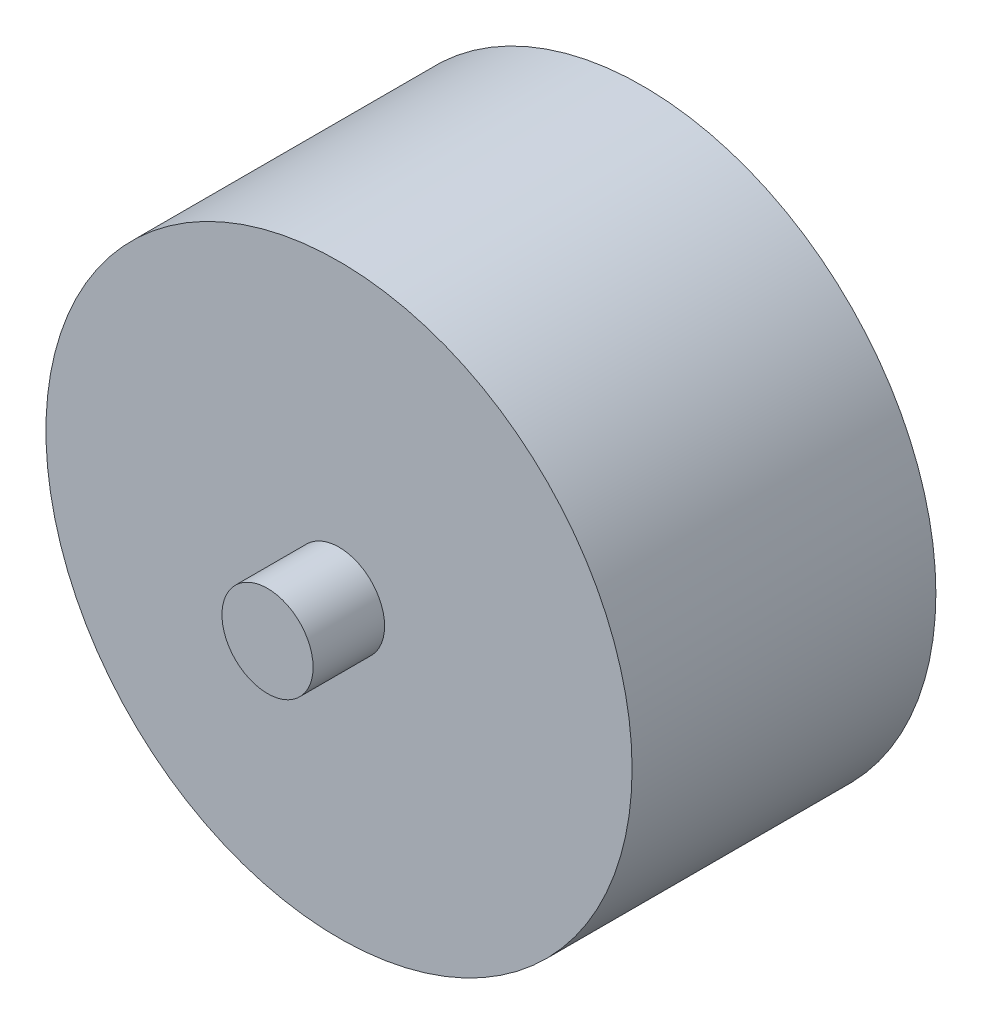
ISO-10303-21;
HEADER;
FILE_DESCRIPTION(('STEP AP214'),'2;1');
FILE_NAME('part.step','',(''),(''),'','','');
FILE_SCHEMA(('AUTOMOTIVE_DESIGN { 1 0 10303 214 1 1 1 1 }'));
ENDSEC;
DATA;
#1=APPLICATION_CONTEXT('core data for automotive mechanical design processes');
#2=APPLICATION_PROTOCOL_DEFINITION('international standard','automotive_design',2000,#1);
#3=PRODUCT_CONTEXT('',#1,'mechanical');
#4=PRODUCT('Part','Part','',(#3));
#5=PRODUCT_RELATED_PRODUCT_CATEGORY('part','',(#4));
#6=PRODUCT_DEFINITION_FORMATION('','',#4);
#7=PRODUCT_DEFINITION_CONTEXT('part definition',#1,'design');
#8=PRODUCT_DEFINITION('design','',#6,#7);
#9=PRODUCT_DEFINITION_SHAPE('','',#8);
#10=(LENGTH_UNIT() NAMED_UNIT(*) SI_UNIT(.MILLI.,.METRE.));
#11=(NAMED_UNIT(*) PLANE_ANGLE_UNIT() SI_UNIT($,.RADIAN.));
#12=(NAMED_UNIT(*) SI_UNIT($,.STERADIAN.) SOLID_ANGLE_UNIT());
#13=UNCERTAINTY_MEASURE_WITH_UNIT(LENGTH_MEASURE(1.E-05),#10,'distance_accuracy_value','');
#14=(GEOMETRIC_REPRESENTATION_CONTEXT(3) GLOBAL_UNCERTAINTY_ASSIGNED_CONTEXT((#13)) GLOBAL_UNIT_ASSIGNED_CONTEXT((#10,
#11,#12)) REPRESENTATION_CONTEXT('',''));
#15=CARTESIAN_POINT('',(0.,0.,0.));
#16=DIRECTION('',(0.,0.,1.));
#17=DIRECTION('',(1.,0.,0.));
#18=AXIS2_PLACEMENT_3D('',#15,#16,#17);
#19=CARTESIAN_POINT('',(0.,0.,-2.));
#20=DIRECTION('',(0.,0.,1.));
#21=DIRECTION('',(1.,0.,0.));
#22=AXIS2_PLACEMENT_3D('',#19,#20,#21);
#23=CYLINDRICAL_SURFACE('',#22,10.075);
#24=CARTESIAN_POINT('',(0.,0.,-2.));
#25=DIRECTION('',(0.,0.,-1.));
#26=DIRECTION('',(-1.,0.,0.));
#27=AXIS2_PLACEMENT_3D('',#24,#25,#26);
#28=CIRCLE('',#27,10.075);
#29=CARTESIAN_POINT('',(-10.075,0.,-2.));
#30=VERTEX_POINT('',#29);
#31=EDGE_CURVE('E11',#30,#30,#28,.T.);
#32=ORIENTED_EDGE('',*,*,#31,.F.);
#33=EDGE_LOOP('',(#32));
#34=FACE_BOUND('',#33,.T.);
#35=CARTESIAN_POINT('',(0.,0.,0.));
#36=DIRECTION('',(0.,0.,-1.));
#37=DIRECTION('',(-1.,0.,0.));
#38=AXIS2_PLACEMENT_3D('',#35,#36,#37);
#39=CIRCLE('',#38,10.075);
#40=CARTESIAN_POINT('',(-10.075,0.,0.));
#41=VERTEX_POINT('',#40);
#42=EDGE_CURVE('E52',#41,#41,#39,.T.);
#43=ORIENTED_EDGE('',*,*,#42,.T.);
#44=EDGE_LOOP('',(#43));
#45=FACE_BOUND('',#44,.T.);
#46=ADVANCED_FACE('F45',(#34,#45),#23,.T.);
#47=CARTESIAN_POINT('',(0.,0.,-2.));
#48=DIRECTION('',(0.,0.,-1.));
#49=DIRECTION('',(-1.,0.,0.));
#50=AXIS2_PLACEMENT_3D('',#47,#48,#49);
#51=PLANE('',#50);
#52=CARTESIAN_POINT('',(0.,8.,-2.));
#53=DIRECTION('',(0.,0.,-1.));
#54=DIRECTION('',(-1.,0.,0.));
#55=AXIS2_PLACEMENT_3D('',#52,#53,#54);
#56=CIRCLE('',#55,1.05);
#57=CARTESIAN_POINT('',(-1.05,8.,-2.));
#58=VERTEX_POINT('',#57);
#59=EDGE_CURVE('E66',#58,#58,#56,.T.);
#60=ORIENTED_EDGE('',*,*,#59,.F.);
#61=EDGE_LOOP('',(#60));
#62=FACE_BOUND('',#61,.T.);
#63=CARTESIAN_POINT('',(-8.,0.,-2.));
#64=DIRECTION('',(0.,0.,-1.));
#65=DIRECTION('',(-1.,0.,0.));
#66=AXIS2_PLACEMENT_3D('',#63,#64,#65);
#67=CIRCLE('',#66,1.05);
#68=CARTESIAN_POINT('',(-9.05,0.,-2.));
#69=VERTEX_POINT('',#68);
#70=EDGE_CURVE('E122',#69,#69,#67,.T.);
#71=ORIENTED_EDGE('',*,*,#70,.F.);
#72=EDGE_LOOP('',(#71));
#73=FACE_BOUND('',#72,.T.);
#74=CARTESIAN_POINT('',(0.,-8.,-2.));
#75=DIRECTION('',(0.,0.,-1.));
#76=DIRECTION('',(-1.,0.,0.));
#77=AXIS2_PLACEMENT_3D('',#74,#75,#76);
#78=CIRCLE('',#77,1.05);
#79=CARTESIAN_POINT('',(-1.04999999999994,-8.,-2.));
#80=VERTEX_POINT('',#79);
#81=EDGE_CURVE('E115',#80,#80,#78,.T.);
#82=ORIENTED_EDGE('',*,*,#81,.F.);
#83=EDGE_LOOP('',(#82));
#84=FACE_BOUND('',#83,.T.);
#85=CARTESIAN_POINT('',(8.,0.,-2.));
#86=DIRECTION('',(0.,0.,-1.));
#87=DIRECTION('',(-1.,0.,0.));
#88=AXIS2_PLACEMENT_3D('',#85,#86,#87);
#89=CIRCLE('',#88,1.05);
#90=CARTESIAN_POINT('',(6.95,0.,-2.));
#91=VERTEX_POINT('',#90);
#92=EDGE_CURVE('E59',#91,#91,#89,.T.);
#93=ORIENTED_EDGE('',*,*,#92,.F.);
#94=EDGE_LOOP('',(#93));
#95=FACE_BOUND('',#94,.T.);
#96=ORIENTED_EDGE('',*,*,#31,.T.);
#97=EDGE_LOOP('',(#96));
#98=FACE_BOUND('',#97,.T.);
#99=ADVANCED_FACE('F90',(#62,#73,#84,#95,#98),#51,.T.);
#100=CARTESIAN_POINT('',(0.,0.,0.));
#101=DIRECTION('',(0.,0.,-1.));
#102=DIRECTION('',(-1.,0.,0.));
#103=AXIS2_PLACEMENT_3D('',#100,#101,#102);
#104=PLANE('',#103);
#105=CARTESIAN_POINT('',(0.,8.,0.));
#106=DIRECTION('',(0.,0.,-1.));
#107=DIRECTION('',(-1.,0.,0.));
#108=AXIS2_PLACEMENT_3D('',#105,#106,#107);
#109=CIRCLE('',#108,1.05);
#110=CARTESIAN_POINT('',(-1.05,8.,0.));
#111=VERTEX_POINT('',#110);
#112=EDGE_CURVE('E48',#111,#111,#109,.T.);
#113=ORIENTED_EDGE('',*,*,#112,.T.);
#114=EDGE_LOOP('',(#113));
#115=FACE_BOUND('',#114,.T.);
#116=CARTESIAN_POINT('',(-8.,0.,0.));
#117=DIRECTION('',(0.,0.,-1.));
#118=DIRECTION('',(-1.,0.,0.));
#119=AXIS2_PLACEMENT_3D('',#116,#117,#118);
#120=CIRCLE('',#119,1.05);
#121=CARTESIAN_POINT('',(-9.05,0.,0.));
#122=VERTEX_POINT('',#121);
#123=EDGE_CURVE('E68',#122,#122,#120,.T.);
#124=ORIENTED_EDGE('',*,*,#123,.T.);
#125=EDGE_LOOP('',(#124));
#126=FACE_BOUND('',#125,.T.);
#127=CARTESIAN_POINT('',(0.,-8.,0.));
#128=DIRECTION('',(0.,0.,-1.));
#129=DIRECTION('',(-1.,0.,0.));
#130=AXIS2_PLACEMENT_3D('',#127,#128,#129);
#131=CIRCLE('',#130,1.05);
#132=CARTESIAN_POINT('',(-1.04999999999994,-8.,0.));
#133=VERTEX_POINT('',#132);
#134=EDGE_CURVE('E65',#133,#133,#131,.T.);
#135=ORIENTED_EDGE('',*,*,#134,.T.);
#136=EDGE_LOOP('',(#135));
#137=FACE_BOUND('',#136,.T.);
#138=CARTESIAN_POINT('',(8.,0.,0.));
#139=DIRECTION('',(0.,0.,-1.));
#140=DIRECTION('',(-1.,0.,0.));
#141=AXIS2_PLACEMENT_3D('',#138,#139,#140);
#142=CIRCLE('',#141,1.05);
#143=CARTESIAN_POINT('',(6.95,0.,0.));
#144=VERTEX_POINT('',#143);
#145=EDGE_CURVE('E62',#144,#144,#142,.T.);
#146=ORIENTED_EDGE('',*,*,#145,.T.);
#147=EDGE_LOOP('',(#146));
#148=FACE_BOUND('',#147,.T.);
#149=ORIENTED_EDGE('',*,*,#42,.F.);
#150=EDGE_LOOP('',(#149));
#151=FACE_BOUND('',#150,.T.);
#152=ADVANCED_FACE('F75',(#115,#126,#137,#148,#151),#104,.F.);
#153=CARTESIAN_POINT('',(8.,0.,8.));
#154=DIRECTION('',(0.,0.,-1.));
#155=DIRECTION('',(-1.,0.,0.));
#156=AXIS2_PLACEMENT_3D('',#153,#154,#155);
#157=CYLINDRICAL_SURFACE('',#156,1.05);
#158=ORIENTED_EDGE('',*,*,#92,.T.);
#159=EDGE_LOOP('',(#158));
#160=FACE_BOUND('',#159,.T.);
#161=ORIENTED_EDGE('',*,*,#145,.F.);
#162=EDGE_LOOP('',(#161));
#163=FACE_BOUND('',#162,.T.);
#164=ADVANCED_FACE('F101',(#160,#163),#157,.F.);
#165=CARTESIAN_POINT('',(0.,-8.,8.));
#166=DIRECTION('',(0.,0.,-1.));
#167=DIRECTION('',(-1.,0.,0.));
#168=AXIS2_PLACEMENT_3D('',#165,#166,#167);
#169=CYLINDRICAL_SURFACE('',#168,1.05);
#170=ORIENTED_EDGE('',*,*,#81,.T.);
#171=EDGE_LOOP('',(#170));
#172=FACE_BOUND('',#171,.T.);
#173=ORIENTED_EDGE('',*,*,#134,.F.);
#174=EDGE_LOOP('',(#173));
#175=FACE_BOUND('',#174,.T.);
#176=ADVANCED_FACE('F85',(#172,#175),#169,.F.);
#177=CARTESIAN_POINT('',(-8.,0.,8.));
#178=DIRECTION('',(0.,0.,-1.));
#179=DIRECTION('',(-1.,0.,0.));
#180=AXIS2_PLACEMENT_3D('',#177,#178,#179);
#181=CYLINDRICAL_SURFACE('',#180,1.05);
#182=ORIENTED_EDGE('',*,*,#70,.T.);
#183=EDGE_LOOP('',(#182));
#184=FACE_BOUND('',#183,.T.);
#185=ORIENTED_EDGE('',*,*,#123,.F.);
#186=EDGE_LOOP('',(#185));
#187=FACE_BOUND('',#186,.T.);
#188=ADVANCED_FACE('F79',(#184,#187),#181,.F.);
#189=CARTESIAN_POINT('',(0.,8.,8.));
#190=DIRECTION('',(0.,0.,-1.));
#191=DIRECTION('',(-1.,0.,0.));
#192=AXIS2_PLACEMENT_3D('',#189,#190,#191);
#193=CYLINDRICAL_SURFACE('',#192,1.05);
#194=ORIENTED_EDGE('',*,*,#59,.T.);
#195=EDGE_LOOP('',(#194));
#196=FACE_BOUND('',#195,.T.);
#197=ORIENTED_EDGE('',*,*,#112,.F.);
#198=EDGE_LOOP('',(#197));
#199=FACE_BOUND('',#198,.T.);
#200=ADVANCED_FACE('F77',(#196,#199),#193,.F.);
#201=CLOSED_SHELL('',(#46,#99,#152,#164,#176,#188,#200));
#202=MANIFOLD_SOLID_BREP('B2',#201);
#203=CARTESIAN_POINT('',(0.,0.,17.));
#204=DIRECTION('',(0.,0.,-1.));
#205=DIRECTION('',(-1.,0.,0.));
#206=AXIS2_PLACEMENT_3D('',#203,#204,#205);
#207=CYLINDRICAL_SURFACE('',#206,16.4);
#208=CARTESIAN_POINT('',(0.,0.,17.));
#209=DIRECTION('',(0.,0.,1.));
#210=DIRECTION('',(1.,0.,0.));
#211=AXIS2_PLACEMENT_3D('',#208,#209,#210);
#212=CIRCLE('',#211,16.4);
#213=CARTESIAN_POINT('',(16.4,0.,17.));
#214=VERTEX_POINT('',#213);
#215=EDGE_CURVE('E178',#214,#214,#212,.T.);
#216=ORIENTED_EDGE('',*,*,#215,.F.);
#217=EDGE_LOOP('',(#216));
#218=FACE_BOUND('',#217,.T.);
#219=CARTESIAN_POINT('',(0.,0.,0.));
#220=DIRECTION('',(0.,0.,1.));
#221=DIRECTION('',(1.,0.,0.));
#222=AXIS2_PLACEMENT_3D('',#219,#220,#221);
#223=CIRCLE('',#222,16.4);
#224=CARTESIAN_POINT('',(16.4,0.,0.));
#225=VERTEX_POINT('',#224);
#226=EDGE_CURVE('E184',#225,#225,#223,.T.);
#227=ORIENTED_EDGE('',*,*,#226,.T.);
#228=EDGE_LOOP('',(#227));
#229=FACE_BOUND('',#228,.T.);
#230=ADVANCED_FACE('F170',(#218,#229),#207,.T.);
#231=CARTESIAN_POINT('',(0.,0.,17.));
#232=DIRECTION('',(0.,0.,1.));
#233=DIRECTION('',(1.,0.,0.));
#234=AXIS2_PLACEMENT_3D('',#231,#232,#233);
#235=PLANE('',#234);
#236=CARTESIAN_POINT('',(0.,0.,17.));
#237=DIRECTION('',(0.,0.,1.));
#238=DIRECTION('',(1.,0.,0.));
#239=AXIS2_PLACEMENT_3D('',#236,#237,#238);
#240=CIRCLE('',#239,2.55);
#241=CARTESIAN_POINT('',(2.55,0.,17.));
#242=VERTEX_POINT('',#241);
#243=EDGE_CURVE('E44',#242,#242,#240,.T.);
#244=ORIENTED_EDGE('',*,*,#243,.F.);
#245=EDGE_LOOP('',(#244));
#246=FACE_BOUND('',#245,.T.);
#247=ORIENTED_EDGE('',*,*,#215,.T.);
#248=EDGE_LOOP('',(#247));
#249=FACE_BOUND('',#248,.T.);
#250=ADVANCED_FACE('F226',(#246,#249),#235,.T.);
#251=CARTESIAN_POINT('',(0.,0.,0.));
#252=DIRECTION('',(0.,0.,1.));
#253=DIRECTION('',(1.,0.,0.));
#254=AXIS2_PLACEMENT_3D('',#251,#252,#253);
#255=PLANE('',#254);
#256=CARTESIAN_POINT('',(0.,8.,0.));
#257=DIRECTION('',(0.,0.,1.));
#258=DIRECTION('',(1.,0.,0.));
#259=AXIS2_PLACEMENT_3D('',#256,#257,#258);
#260=CIRCLE('',#259,1.05);
#261=CARTESIAN_POINT('',(1.05,8.,0.));
#262=VERTEX_POINT('',#261);
#263=EDGE_CURVE('E173',#262,#262,#260,.T.);
#264=ORIENTED_EDGE('',*,*,#263,.T.);
#265=EDGE_LOOP('',(#264));
#266=FACE_BOUND('',#265,.T.);
#267=CARTESIAN_POINT('',(-8.,0.,0.));
#268=DIRECTION('',(0.,0.,1.));
#269=DIRECTION('',(1.,0.,0.));
#270=AXIS2_PLACEMENT_3D('',#267,#268,#269);
#271=CIRCLE('',#270,1.05);
#272=CARTESIAN_POINT('',(-6.95,0.,0.));
#273=VERTEX_POINT('',#272);
#274=EDGE_CURVE('E201',#273,#273,#271,.T.);
#275=ORIENTED_EDGE('',*,*,#274,.T.);
#276=EDGE_LOOP('',(#275));
#277=FACE_BOUND('',#276,.T.);
#278=CARTESIAN_POINT('',(0.,-8.,0.));
#279=DIRECTION('',(0.,0.,1.));
#280=DIRECTION('',(1.,0.,0.));
#281=AXIS2_PLACEMENT_3D('',#278,#279,#280);
#282=CIRCLE('',#281,1.05);
#283=CARTESIAN_POINT('',(1.05000000000006,-8.,0.));
#284=VERTEX_POINT('',#283);
#285=EDGE_CURVE('E197',#284,#284,#282,.T.);
#286=ORIENTED_EDGE('',*,*,#285,.T.);
#287=EDGE_LOOP('',(#286));
#288=FACE_BOUND('',#287,.T.);
#289=CARTESIAN_POINT('',(8.,0.,0.));
#290=DIRECTION('',(0.,0.,1.));
#291=DIRECTION('',(1.,0.,0.));
#292=AXIS2_PLACEMENT_3D('',#289,#290,#291);
#293=CIRCLE('',#292,1.05);
#294=CARTESIAN_POINT('',(9.05,0.,0.));
#295=VERTEX_POINT('',#294);
#296=EDGE_CURVE('E193',#295,#295,#293,.T.);
#297=ORIENTED_EDGE('',*,*,#296,.T.);
#298=EDGE_LOOP('',(#297));
#299=FACE_BOUND('',#298,.T.);
#300=ORIENTED_EDGE('',*,*,#226,.F.);
#301=EDGE_LOOP('',(#300));
#302=FACE_BOUND('',#301,.T.);
#303=ADVANCED_FACE('F218',(#266,#277,#288,#299,#302),#255,.F.);
#304=CARTESIAN_POINT('',(0.,0.,21.));
#305=DIRECTION('',(0.,0.,-1.));
#306=DIRECTION('',(-1.,0.,0.));
#307=AXIS2_PLACEMENT_3D('',#304,#305,#306);
#308=CYLINDRICAL_SURFACE('',#307,2.55);
#309=CARTESIAN_POINT('',(0.,0.,21.));
#310=DIRECTION('',(0.,0.,1.));
#311=DIRECTION('',(1.,0.,0.));
#312=AXIS2_PLACEMENT_3D('',#309,#310,#311);
#313=CIRCLE('',#312,2.55);
#314=CARTESIAN_POINT('',(2.55,0.,21.));
#315=VERTEX_POINT('',#314);
#316=EDGE_CURVE('E187',#315,#315,#313,.T.);
#317=ORIENTED_EDGE('',*,*,#316,.F.);
#318=EDGE_LOOP('',(#317));
#319=FACE_BOUND('',#318,.T.);
#320=ORIENTED_EDGE('',*,*,#243,.T.);
#321=EDGE_LOOP('',(#320));
#322=FACE_BOUND('',#321,.T.);
#323=ADVANCED_FACE('F216',(#319,#322),#308,.T.);
#324=CARTESIAN_POINT('',(0.,0.,21.));
#325=DIRECTION('',(0.,0.,1.));
#326=DIRECTION('',(1.,0.,0.));
#327=AXIS2_PLACEMENT_3D('',#324,#325,#326);
#328=PLANE('',#327);
#329=ORIENTED_EDGE('',*,*,#316,.T.);
#330=EDGE_LOOP('',(#329));
#331=FACE_BOUND('',#330,.T.);
#332=ADVANCED_FACE('F214',(#331),#328,.T.);
#333=CARTESIAN_POINT('',(8.,0.,8.));
#334=DIRECTION('',(0.,0.,-1.));
#335=DIRECTION('',(-1.,0.,0.));
#336=AXIS2_PLACEMENT_3D('',#333,#334,#335);
#337=CYLINDRICAL_SURFACE('',#336,1.05);
#338=CARTESIAN_POINT('',(8.,0.,8.));
#339=DIRECTION('',(0.,0.,-1.));
#340=DIRECTION('',(-1.,0.,0.));
#341=AXIS2_PLACEMENT_3D('',#338,#339,#340);
#342=CIRCLE('',#341,1.05);
#343=CARTESIAN_POINT('',(6.95,0.,8.));
#344=VERTEX_POINT('',#343);
#345=EDGE_CURVE('E344',#344,#344,#342,.T.);
#346=ORIENTED_EDGE('',*,*,#345,.F.);
#347=EDGE_LOOP('',(#346));
#348=FACE_BOUND('',#347,.T.);
#349=ORIENTED_EDGE('',*,*,#296,.F.);
#350=EDGE_LOOP('',(#349));
#351=FACE_BOUND('',#350,.T.);
#352=ADVANCED_FACE('F224',(#348,#351),#337,.F.);
#353=CARTESIAN_POINT('',(0.,0.,8.));
#354=DIRECTION('',(0.,0.,-1.));
#355=DIRECTION('',(-1.,0.,0.));
#356=AXIS2_PLACEMENT_3D('',#353,#354,#355);
#357=PLANE('',#356);
#358=ORIENTED_EDGE('',*,*,#345,.T.);
#359=EDGE_LOOP('',(#358));
#360=FACE_BOUND('',#359,.T.);
#361=ADVANCED_FACE('F258',(#360),#357,.T.);
#362=CARTESIAN_POINT('',(0.,-8.,8.));
#363=DIRECTION('',(0.,0.,-1.));
#364=DIRECTION('',(-1.,0.,0.));
#365=AXIS2_PLACEMENT_3D('',#362,#363,#364);
#366=CYLINDRICAL_SURFACE('',#365,1.05);
#367=CARTESIAN_POINT('',(0.,-8.,8.));
#368=DIRECTION('',(0.,0.,-1.));
#369=DIRECTION('',(-1.,0.,0.));
#370=AXIS2_PLACEMENT_3D('',#367,#368,#369);
#371=CIRCLE('',#370,1.05);
#372=CARTESIAN_POINT('',(-1.04999999999994,-8.,8.));
#373=VERTEX_POINT('',#372);
#374=EDGE_CURVE('E339',#373,#373,#371,.T.);
#375=ORIENTED_EDGE('',*,*,#374,.F.);
#376=EDGE_LOOP('',(#375));
#377=FACE_BOUND('',#376,.T.);
#378=ORIENTED_EDGE('',*,*,#285,.F.);
#379=EDGE_LOOP('',(#378));
#380=FACE_BOUND('',#379,.T.);
#381=ADVANCED_FACE('F268',(#377,#380),#366,.F.);
#382=CARTESIAN_POINT('',(0.,0.,8.));
#383=DIRECTION('',(0.,0.,-1.));
#384=DIRECTION('',(-1.,0.,0.));
#385=AXIS2_PLACEMENT_3D('',#382,#383,#384);
#386=PLANE('',#385);
#387=ORIENTED_EDGE('',*,*,#374,.T.);
#388=EDGE_LOOP('',(#387));
#389=FACE_BOUND('',#388,.T.);
#390=ADVANCED_FACE('F278',(#389),#386,.T.);
#391=CARTESIAN_POINT('',(-8.,0.,8.));
#392=DIRECTION('',(0.,0.,-1.));
#393=DIRECTION('',(-1.,0.,0.));
#394=AXIS2_PLACEMENT_3D('',#391,#392,#393);
#395=CYLINDRICAL_SURFACE('',#394,1.05);
#396=CARTESIAN_POINT('',(-8.,0.,8.));
#397=DIRECTION('',(0.,0.,-1.));
#398=DIRECTION('',(-1.,0.,0.));
#399=AXIS2_PLACEMENT_3D('',#396,#397,#398);
#400=CIRCLE('',#399,1.05);
#401=CARTESIAN_POINT('',(-9.05,0.,8.));
#402=VERTEX_POINT('',#401);
#403=EDGE_CURVE('E335',#402,#402,#400,.T.);
#404=ORIENTED_EDGE('',*,*,#403,.F.);
#405=EDGE_LOOP('',(#404));
#406=FACE_BOUND('',#405,.T.);
#407=ORIENTED_EDGE('',*,*,#274,.F.);
#408=EDGE_LOOP('',(#407));
#409=FACE_BOUND('',#408,.T.);
#410=ADVANCED_FACE('F288',(#406,#409),#395,.F.);
#411=CARTESIAN_POINT('',(0.,0.,8.));
#412=DIRECTION('',(0.,0.,-1.));
#413=DIRECTION('',(-1.,0.,0.));
#414=AXIS2_PLACEMENT_3D('',#411,#412,#413);
#415=PLANE('',#414);
#416=ORIENTED_EDGE('',*,*,#403,.T.);
#417=EDGE_LOOP('',(#416));
#418=FACE_BOUND('',#417,.T.);
#419=ADVANCED_FACE('F298',(#418),#415,.T.);
#420=CARTESIAN_POINT('',(0.,8.,8.));
#421=DIRECTION('',(0.,0.,-1.));
#422=DIRECTION('',(-1.,0.,0.));
#423=AXIS2_PLACEMENT_3D('',#420,#421,#422);
#424=CYLINDRICAL_SURFACE('',#423,1.05);
#425=CARTESIAN_POINT('',(0.,8.,8.));
#426=DIRECTION('',(0.,0.,-1.));
#427=DIRECTION('',(-1.,0.,0.));
#428=AXIS2_PLACEMENT_3D('',#425,#426,#427);
#429=CIRCLE('',#428,1.05);
#430=CARTESIAN_POINT('',(-1.05,8.,8.));
#431=VERTEX_POINT('',#430);
#432=EDGE_CURVE('E198',#431,#431,#429,.T.);
#433=ORIENTED_EDGE('',*,*,#432,.F.);
#434=EDGE_LOOP('',(#433));
#435=FACE_BOUND('',#434,.T.);
#436=ORIENTED_EDGE('',*,*,#263,.F.);
#437=EDGE_LOOP('',(#436));
#438=FACE_BOUND('',#437,.T.);
#439=ADVANCED_FACE('F308',(#435,#438),#424,.F.);
#440=CARTESIAN_POINT('',(0.,0.,8.));
#441=DIRECTION('',(0.,0.,-1.));
#442=DIRECTION('',(-1.,0.,0.));
#443=AXIS2_PLACEMENT_3D('',#440,#441,#442);
#444=PLANE('',#443);
#445=ORIENTED_EDGE('',*,*,#432,.T.);
#446=EDGE_LOOP('',(#445));
#447=FACE_BOUND('',#446,.T.);
#448=ADVANCED_FACE('F318',(#447),#444,.T.);
#449=CLOSED_SHELL('',(#230,#250,#303,#323,#332,#352,#361,#381,#390,#410,#419,#439,#448));
#450=MANIFOLD_SOLID_BREP('B6',#449);
#451=ADVANCED_BREP_SHAPE_REPRESENTATION('',(#18,#202,#450),#14);
#452=SHAPE_DEFINITION_REPRESENTATION(#9,#451);
ENDSEC;
END-ISO-10303-21;
